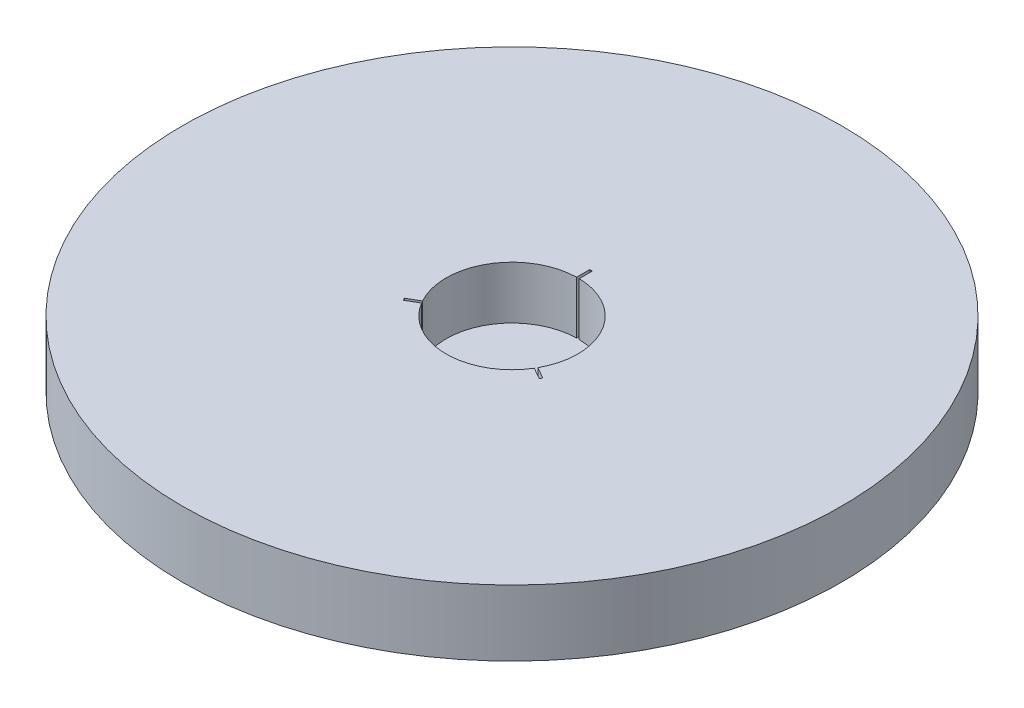
ISO-10303-21;
HEADER;
FILE_DESCRIPTION(('STEP AP214'),'2;1');
FILE_NAME('part.step','',(''),(''),'','','');
FILE_SCHEMA(('AUTOMOTIVE_DESIGN { 1 0 10303 214 1 1 1 1 }'));
ENDSEC;
DATA;
#1=APPLICATION_CONTEXT('core data for automotive mechanical design processes');
#2=APPLICATION_PROTOCOL_DEFINITION('international standard','automotive_design',2000,#1);
#3=PRODUCT_CONTEXT('',#1,'mechanical');
#4=PRODUCT('Part','Part','',(#3));
#5=PRODUCT_RELATED_PRODUCT_CATEGORY('part','',(#4));
#6=PRODUCT_DEFINITION_FORMATION('','',#4);
#7=PRODUCT_DEFINITION_CONTEXT('part definition',#1,'design');
#8=PRODUCT_DEFINITION('design','',#6,#7);
#9=PRODUCT_DEFINITION_SHAPE('','',#8);
#10=(LENGTH_UNIT() NAMED_UNIT(*) SI_UNIT(.MILLI.,.METRE.));
#11=(NAMED_UNIT(*) PLANE_ANGLE_UNIT() SI_UNIT($,.RADIAN.));
#12=(NAMED_UNIT(*) SI_UNIT($,.STERADIAN.) SOLID_ANGLE_UNIT());
#13=UNCERTAINTY_MEASURE_WITH_UNIT(LENGTH_MEASURE(1.E-05),#10,'distance_accuracy_value','');
#14=(GEOMETRIC_REPRESENTATION_CONTEXT(3) GLOBAL_UNCERTAINTY_ASSIGNED_CONTEXT((#13)) GLOBAL_UNIT_ASSIGNED_CONTEXT((#10,
#11,#12)) REPRESENTATION_CONTEXT('',''));
#15=CARTESIAN_POINT('',(0.,0.,0.));
#16=DIRECTION('',(0.,0.,1.));
#17=DIRECTION('',(1.,0.,0.));
#18=AXIS2_PLACEMENT_3D('',#15,#16,#17);
#19=CARTESIAN_POINT('',(0.,25.,0.));
#20=DIRECTION('',(0.,-1.,0.));
#21=DIRECTION('',(0.,0.,-1.));
#22=AXIS2_PLACEMENT_3D('',#19,#20,#21);
#23=CYLINDRICAL_SURFACE('',#22,25.);
#24=DIRECTION('',(0.,-1.,0.));
#25=VECTOR('',#24,1.);
#26=CARTESIAN_POINT('',(0.500000000000007,25.,-24.9949994999));
#27=LINE('',#26,#25);
#28=CARTESIAN_POINT('',(0.500000000000007,25.,-24.9949994999));
#29=VERTEX_POINT('',#28);
#30=CARTESIAN_POINT('',(0.500000000000007,5.,-24.9949994999));
#31=VERTEX_POINT('',#30);
#32=EDGE_CURVE('E132',#29,#31,#27,.T.);
#33=ORIENTED_EDGE('',*,*,#32,.T.);
#34=CARTESIAN_POINT('',(0.,5.,0.));
#35=DIRECTION('',(0.,-1.,0.));
#36=DIRECTION('',(0.,0.,-1.));
#37=AXIS2_PLACEMENT_3D('',#34,#35,#36);
#38=CIRCLE('',#37,25.);
#39=CARTESIAN_POINT('',(21.8963045344932,5.,12.0644870480569));
#40=VERTEX_POINT('',#39);
#41=EDGE_CURVE('E123',#31,#40,#38,.T.);
#42=ORIENTED_EDGE('',*,*,#41,.T.);
#43=DIRECTION('',(0.,-1.,0.));
#44=VECTOR('',#43,1.);
#45=CARTESIAN_POINT('',(21.8963045344932,25.,12.0644870480569));
#46=LINE('',#45,#44);
#47=CARTESIAN_POINT('',(21.8963045344932,25.,12.0644870480569));
#48=VERTEX_POINT('',#47);
#49=EDGE_CURVE('E129',#48,#40,#46,.T.);
#50=ORIENTED_EDGE('',*,*,#49,.F.);
#51=CARTESIAN_POINT('',(0.,25.,0.));
#52=DIRECTION('',(0.,1.,0.));
#53=DIRECTION('',(0.,0.,1.));
#54=AXIS2_PLACEMENT_3D('',#51,#52,#53);
#55=CIRCLE('',#54,25.);
#56=EDGE_CURVE('E133',#48,#29,#55,.T.);
#57=ORIENTED_EDGE('',*,*,#56,.T.);
#58=EDGE_LOOP('',(#33,#42,#50,#57));
#59=FACE_BOUND('',#58,.T.);
#60=ADVANCED_FACE('F36',(#59),#23,.F.);
#61=CARTESIAN_POINT('',(0.500000000000007,25.,-29.9949994999));
#62=DIRECTION('',(-1.,0.,0.));
#63=DIRECTION('',(0.,0.,1.));
#64=AXIS2_PLACEMENT_3D('',#61,#62,#63);
#65=PLANE('',#64);
#66=DIRECTION('',(0.,-1.,0.));
#67=VECTOR('',#66,1.);
#68=CARTESIAN_POINT('',(0.500000000000007,25.,-29.9949994999));
#69=LINE('',#68,#67);
#70=CARTESIAN_POINT('',(0.500000000000007,25.,-29.9949994999));
#71=VERTEX_POINT('',#70);
#72=CARTESIAN_POINT('',(0.500000000000008,5.,-29.9949994999));
#73=VERTEX_POINT('',#72);
#74=EDGE_CURVE('E169',#71,#73,#69,.T.);
#75=ORIENTED_EDGE('',*,*,#74,.T.);
#76=DIRECTION('',(0.,0.,1.));
#77=VECTOR('',#76,1.);
#78=CARTESIAN_POINT('',(0.500000000000007,5.,-29.9949994999));
#79=LINE('',#78,#77);
#80=EDGE_CURVE('E134',#73,#31,#79,.T.);
#81=ORIENTED_EDGE('',*,*,#80,.T.);
#82=ORIENTED_EDGE('',*,*,#32,.F.);
#83=DIRECTION('',(0.,0.,-1.));
#84=VECTOR('',#83,1.);
#85=CARTESIAN_POINT('',(0.500000000000007,25.,-29.9949994999));
#86=LINE('',#85,#84);
#87=EDGE_CURVE('E339',#29,#71,#86,.T.);
#88=ORIENTED_EDGE('',*,*,#87,.T.);
#89=EDGE_LOOP('',(#75,#81,#82,#88));
#90=FACE_BOUND('',#89,.T.);
#91=ADVANCED_FACE('F190',(#90),#65,.T.);
#92=CARTESIAN_POINT('',(-0.499999999999994,25.,-29.9949994999));
#93=DIRECTION('',(0.,0.,1.));
#94=DIRECTION('',(1.,0.,0.));
#95=AXIS2_PLACEMENT_3D('',#92,#93,#94);
#96=PLANE('',#95);
#97=DIRECTION('',(0.,-1.,0.));
#98=VECTOR('',#97,1.);
#99=CARTESIAN_POINT('',(-0.499999999999994,25.,-29.9949994999));
#100=LINE('',#99,#98);
#101=CARTESIAN_POINT('',(-0.499999999999994,25.,-29.9949994999));
#102=VERTEX_POINT('',#101);
#103=CARTESIAN_POINT('',(-0.499999999999994,5.,-29.9949994999));
#104=VERTEX_POINT('',#103);
#105=EDGE_CURVE('E166',#102,#104,#100,.T.);
#106=ORIENTED_EDGE('',*,*,#105,.T.);
#107=DIRECTION('',(1.,0.,0.));
#108=VECTOR('',#107,1.);
#109=CARTESIAN_POINT('',(-0.499999999999994,5.,-29.9949994999));
#110=LINE('',#109,#108);
#111=EDGE_CURVE('E386',#104,#73,#110,.T.);
#112=ORIENTED_EDGE('',*,*,#111,.T.);
#113=ORIENTED_EDGE('',*,*,#74,.F.);
#114=DIRECTION('',(-1.,0.,0.));
#115=VECTOR('',#114,1.);
#116=CARTESIAN_POINT('',(-0.499999999999994,25.,-29.9949994999));
#117=LINE('',#116,#115);
#118=EDGE_CURVE('E341',#71,#102,#117,.T.);
#119=ORIENTED_EDGE('',*,*,#118,.T.);
#120=EDGE_LOOP('',(#106,#112,#113,#119));
#121=FACE_BOUND('',#120,.T.);
#122=ADVANCED_FACE('F195',(#121),#96,.T.);
#123=CARTESIAN_POINT('',(-0.499999999999994,25.,-29.9949994999));
#124=DIRECTION('',(1.,0.,0.));
#125=DIRECTION('',(0.,0.,-1.));
#126=AXIS2_PLACEMENT_3D('',#123,#124,#125);
#127=PLANE('',#126);
#128=DIRECTION('',(0.,-1.,0.));
#129=VECTOR('',#128,1.);
#130=CARTESIAN_POINT('',(-0.499999999999994,25.,-24.9949994999));
#131=LINE('',#130,#129);
#132=CARTESIAN_POINT('',(-0.499999999999994,25.,-24.9949994999));
#133=VERTEX_POINT('',#132);
#134=CARTESIAN_POINT('',(-0.499999999999993,5.,-24.9949994999));
#135=VERTEX_POINT('',#134);
#136=EDGE_CURVE('E163',#133,#135,#131,.T.);
#137=ORIENTED_EDGE('',*,*,#136,.T.);
#138=DIRECTION('',(0.,0.,-1.));
#139=VECTOR('',#138,1.);
#140=CARTESIAN_POINT('',(-0.499999999999994,5.,-29.9949994999));
#141=LINE('',#140,#139);
#142=EDGE_CURVE('E383',#135,#104,#141,.T.);
#143=ORIENTED_EDGE('',*,*,#142,.T.);
#144=ORIENTED_EDGE('',*,*,#105,.F.);
#145=DIRECTION('',(0.,0.,1.));
#146=VECTOR('',#145,1.);
#147=CARTESIAN_POINT('',(-0.499999999999994,25.,-29.9949994999));
#148=LINE('',#147,#146);
#149=EDGE_CURVE('E346',#102,#133,#148,.T.);
#150=ORIENTED_EDGE('',*,*,#149,.T.);
#151=EDGE_LOOP('',(#137,#143,#144,#150));
#152=FACE_BOUND('',#151,.T.);
#153=ADVANCED_FACE('F201',(#152),#127,.T.);
#154=CARTESIAN_POINT('',(0.,25.,0.));
#155=DIRECTION('',(0.,-1.,0.));
#156=DIRECTION('',(0.,0.,-1.));
#157=AXIS2_PLACEMENT_3D('',#154,#155,#156);
#158=CYLINDRICAL_SURFACE('',#157,25.);
#159=DIRECTION('',(0.,-1.,0.));
#160=VECTOR('',#159,1.);
#161=CARTESIAN_POINT('',(-21.8963045344923,25.,12.0644870480585));
#162=LINE('',#161,#160);
#163=CARTESIAN_POINT('',(-21.8963045344923,25.,12.0644870480585));
#164=VERTEX_POINT('',#163);
#165=CARTESIAN_POINT('',(-21.8963045344923,5.,12.0644870480585));
#166=VERTEX_POINT('',#165);
#167=EDGE_CURVE('E160',#164,#166,#162,.T.);
#168=ORIENTED_EDGE('',*,*,#167,.T.);
#169=CARTESIAN_POINT('',(0.,5.,0.));
#170=DIRECTION('',(0.,-1.,0.));
#171=DIRECTION('',(0.,0.,-1.));
#172=AXIS2_PLACEMENT_3D('',#169,#170,#171);
#173=CIRCLE('',#172,25.);
#174=EDGE_CURVE('E380',#166,#135,#173,.T.);
#175=ORIENTED_EDGE('',*,*,#174,.T.);
#176=ORIENTED_EDGE('',*,*,#136,.F.);
#177=CARTESIAN_POINT('',(0.,25.,0.));
#178=DIRECTION('',(0.,1.,0.));
#179=DIRECTION('',(0.,0.,1.));
#180=AXIS2_PLACEMENT_3D('',#177,#178,#179);
#181=CIRCLE('',#180,25.);
#182=EDGE_CURVE('E348',#133,#164,#181,.T.);
#183=ORIENTED_EDGE('',*,*,#182,.T.);
#184=EDGE_LOOP('',(#168,#175,#176,#183));
#185=FACE_BOUND('',#184,.T.);
#186=ADVANCED_FACE('F205',(#185),#158,.F.);
#187=CARTESIAN_POINT('',(-26.2264315534145,25.,14.5644870480585));
#188=DIRECTION('',(0.5,0.,0.866025403784439));
#189=DIRECTION('',(0.866025403784439,0.,-0.5));
#190=AXIS2_PLACEMENT_3D('',#187,#188,#189);
#191=PLANE('',#190);
#192=DIRECTION('',(0.,-1.,0.));
#193=VECTOR('',#192,1.);
#194=CARTESIAN_POINT('',(-26.2264315534145,25.,14.5644870480585));
#195=LINE('',#194,#193);
#196=CARTESIAN_POINT('',(-26.2264315534145,25.,14.5644870480585));
#197=VERTEX_POINT('',#196);
#198=CARTESIAN_POINT('',(-26.2264315534145,5.,14.5644870480585));
#199=VERTEX_POINT('',#198);
#200=EDGE_CURVE('E157',#197,#199,#195,.T.);
#201=ORIENTED_EDGE('',*,*,#200,.T.);
#202=DIRECTION('',(0.866025403784439,0.,-0.5));
#203=VECTOR('',#202,1.);
#204=CARTESIAN_POINT('',(-26.2264315534145,5.,14.5644870480585));
#205=LINE('',#204,#203);
#206=EDGE_CURVE('E377',#199,#166,#205,.T.);
#207=ORIENTED_EDGE('',*,*,#206,.T.);
#208=ORIENTED_EDGE('',*,*,#167,.F.);
#209=DIRECTION('',(-0.866025403784439,0.,0.5));
#210=VECTOR('',#209,1.);
#211=CARTESIAN_POINT('',(-26.2264315534145,25.,14.5644870480585));
#212=LINE('',#211,#210);
#213=EDGE_CURVE('E350',#164,#197,#212,.T.);
#214=ORIENTED_EDGE('',*,*,#213,.T.);
#215=EDGE_LOOP('',(#201,#207,#208,#214));
#216=FACE_BOUND('',#215,.T.);
#217=ADVANCED_FACE('F209',(#216),#191,.T.);
#218=CARTESIAN_POINT('',(-25.7264315534145,25.,15.4305124518429));
#219=DIRECTION('',(0.86602540378444,0.,-0.499999999999998));
#220=DIRECTION('',(-0.499999999999998,0.,-0.86602540378444));
#221=AXIS2_PLACEMENT_3D('',#218,#219,#220);
#222=PLANE('',#221);
#223=DIRECTION('',(0.,-1.,0.));
#224=VECTOR('',#223,1.);
#225=CARTESIAN_POINT('',(-25.7264315534145,25.,15.4305124518429));
#226=LINE('',#225,#224);
#227=CARTESIAN_POINT('',(-25.7264315534145,25.,15.4305124518429));
#228=VERTEX_POINT('',#227);
#229=CARTESIAN_POINT('',(-25.7264315534145,5.,15.4305124518429));
#230=VERTEX_POINT('',#229);
#231=EDGE_CURVE('E154',#228,#230,#226,.T.);
#232=ORIENTED_EDGE('',*,*,#231,.T.);
#233=DIRECTION('',(-0.499999999999998,0.,-0.86602540378444));
#234=VECTOR('',#233,1.);
#235=CARTESIAN_POINT('',(-25.7264315534145,5.,15.4305124518429));
#236=LINE('',#235,#234);
#237=EDGE_CURVE('E371',#230,#199,#236,.T.);
#238=ORIENTED_EDGE('',*,*,#237,.T.);
#239=ORIENTED_EDGE('',*,*,#200,.F.);
#240=DIRECTION('',(0.499999999999998,0.,0.86602540378444));
#241=VECTOR('',#240,1.);
#242=CARTESIAN_POINT('',(-25.7264315534145,25.,15.4305124518429));
#243=LINE('',#242,#241);
#244=EDGE_CURVE('E352',#197,#228,#243,.T.);
#245=ORIENTED_EDGE('',*,*,#244,.T.);
#246=EDGE_LOOP('',(#232,#238,#239,#245));
#247=FACE_BOUND('',#246,.T.);
#248=ADVANCED_FACE('F213',(#247),#222,.T.);
#249=CARTESIAN_POINT('',(-25.7264315534145,25.,15.4305124518429));
#250=DIRECTION('',(-0.5,0.,-0.866025403784439));
#251=DIRECTION('',(-0.866025403784439,0.,0.5));
#252=AXIS2_PLACEMENT_3D('',#249,#250,#251);
#253=PLANE('',#252);
#254=DIRECTION('',(0.,-1.,0.));
#255=VECTOR('',#254,1.);
#256=CARTESIAN_POINT('',(-21.3963045344923,25.,12.9305124518429));
#257=LINE('',#256,#255);
#258=CARTESIAN_POINT('',(-21.3963045344923,25.,12.9305124518429));
#259=VERTEX_POINT('',#258);
#260=CARTESIAN_POINT('',(-21.3963045344923,5.,12.9305124518429));
#261=VERTEX_POINT('',#260);
#262=EDGE_CURVE('E151',#259,#261,#257,.T.);
#263=ORIENTED_EDGE('',*,*,#262,.T.);
#264=DIRECTION('',(-0.866025403784439,0.,0.5));
#265=VECTOR('',#264,1.);
#266=CARTESIAN_POINT('',(-25.7264315534145,5.,15.4305124518429));
#267=LINE('',#266,#265);
#268=EDGE_CURVE('E368',#261,#230,#267,.T.);
#269=ORIENTED_EDGE('',*,*,#268,.T.);
#270=ORIENTED_EDGE('',*,*,#231,.F.);
#271=DIRECTION('',(0.866025403784439,0.,-0.5));
#272=VECTOR('',#271,1.);
#273=CARTESIAN_POINT('',(-25.7264315534145,25.,15.4305124518429));
#274=LINE('',#273,#272);
#275=EDGE_CURVE('E354',#228,#259,#274,.T.);
#276=ORIENTED_EDGE('',*,*,#275,.T.);
#277=EDGE_LOOP('',(#263,#269,#270,#276));
#278=FACE_BOUND('',#277,.T.);
#279=ADVANCED_FACE('F217',(#278),#253,.T.);
#280=CARTESIAN_POINT('',(0.,25.,0.));
#281=DIRECTION('',(0.,-1.,0.));
#282=DIRECTION('',(0.,0.,-1.));
#283=AXIS2_PLACEMENT_3D('',#280,#281,#282);
#284=CYLINDRICAL_SURFACE('',#283,25.);
#285=DIRECTION('',(0.,-1.,0.));
#286=VECTOR('',#285,1.);
#287=CARTESIAN_POINT('',(21.3963045344933,25.,12.9305124518413));
#288=LINE('',#287,#286);
#289=CARTESIAN_POINT('',(21.3963045344933,25.,12.9305124518413));
#290=VERTEX_POINT('',#289);
#291=CARTESIAN_POINT('',(21.3963045344932,5.,12.9305124518413));
#292=VERTEX_POINT('',#291);
#293=EDGE_CURVE('E148',#290,#292,#288,.T.);
#294=ORIENTED_EDGE('',*,*,#293,.T.);
#295=CARTESIAN_POINT('',(0.,5.,0.));
#296=DIRECTION('',(0.,-1.,0.));
#297=DIRECTION('',(0.,0.,-1.));
#298=AXIS2_PLACEMENT_3D('',#295,#296,#297);
#299=CIRCLE('',#298,25.);
#300=EDGE_CURVE('E365',#292,#261,#299,.T.);
#301=ORIENTED_EDGE('',*,*,#300,.T.);
#302=ORIENTED_EDGE('',*,*,#262,.F.);
#303=CARTESIAN_POINT('',(0.,25.,0.));
#304=DIRECTION('',(0.,1.,0.));
#305=DIRECTION('',(0.,0.,1.));
#306=AXIS2_PLACEMENT_3D('',#303,#304,#305);
#307=CIRCLE('',#306,25.);
#308=EDGE_CURVE('E356',#259,#290,#307,.T.);
#309=ORIENTED_EDGE('',*,*,#308,.T.);
#310=EDGE_LOOP('',(#294,#301,#302,#309));
#311=FACE_BOUND('',#310,.T.);
#312=ADVANCED_FACE('F221',(#311),#284,.F.);
#313=CARTESIAN_POINT('',(25.726431553415,25.,15.4305124518411));
#314=DIRECTION('',(0.5,0.,-0.866025403784439));
#315=DIRECTION('',(-0.866025403784439,0.,-0.5));
#316=AXIS2_PLACEMENT_3D('',#313,#314,#315);
#317=PLANE('',#316);
#318=DIRECTION('',(0.,-1.,0.));
#319=VECTOR('',#318,1.);
#320=CARTESIAN_POINT('',(25.726431553415,25.,15.4305124518411));
#321=LINE('',#320,#319);
#322=CARTESIAN_POINT('',(25.726431553415,25.,15.4305124518411));
#323=VERTEX_POINT('',#322);
#324=CARTESIAN_POINT('',(25.726431553415,5.,15.4305124518411));
#325=VERTEX_POINT('',#324);
#326=EDGE_CURVE('E140',#323,#325,#321,.T.);
#327=ORIENTED_EDGE('',*,*,#326,.T.);
#328=DIRECTION('',(-0.866025403784439,0.,-0.5));
#329=VECTOR('',#328,1.);
#330=CARTESIAN_POINT('',(25.726431553415,5.,15.4305124518411));
#331=LINE('',#330,#329);
#332=EDGE_CURVE('E395',#325,#292,#331,.T.);
#333=ORIENTED_EDGE('',*,*,#332,.T.);
#334=ORIENTED_EDGE('',*,*,#293,.F.);
#335=DIRECTION('',(0.866025403784439,0.,0.5));
#336=VECTOR('',#335,1.);
#337=CARTESIAN_POINT('',(25.726431553415,25.,15.4305124518411));
#338=LINE('',#337,#336);
#339=EDGE_CURVE('E336',#290,#323,#338,.T.);
#340=ORIENTED_EDGE('',*,*,#339,.T.);
#341=EDGE_LOOP('',(#327,#333,#334,#340));
#342=FACE_BOUND('',#341,.T.);
#343=ADVANCED_FACE('F225',(#342),#317,.T.);
#344=CARTESIAN_POINT('',(26.2264315534149,25.,14.5644870480566));
#345=DIRECTION('',(-0.866025403784439,0.,-0.499999999999999));
#346=DIRECTION('',(-0.499999999999999,0.,0.866025403784439));
#347=AXIS2_PLACEMENT_3D('',#344,#345,#346);
#348=PLANE('',#347);
#349=DIRECTION('',(0.,-1.,0.));
#350=VECTOR('',#349,1.);
#351=CARTESIAN_POINT('',(26.2264315534149,25.,14.5644870480566));
#352=LINE('',#351,#350);
#353=CARTESIAN_POINT('',(26.2264315534149,25.,14.5644870480567));
#354=VERTEX_POINT('',#353);
#355=CARTESIAN_POINT('',(26.2264315534149,5.,14.5644870480566));
#356=VERTEX_POINT('',#355);
#357=EDGE_CURVE('E57',#354,#356,#352,.T.);
#358=ORIENTED_EDGE('',*,*,#357,.T.);
#359=DIRECTION('',(-0.499999999999999,0.,0.866025403784439));
#360=VECTOR('',#359,1.);
#361=CARTESIAN_POINT('',(26.2264315534149,5.,14.5644870480566));
#362=LINE('',#361,#360);
#363=EDGE_CURVE('E51',#356,#325,#362,.T.);
#364=ORIENTED_EDGE('',*,*,#363,.T.);
#365=ORIENTED_EDGE('',*,*,#326,.F.);
#366=DIRECTION('',(0.499999999999999,0.,-0.866025403784439));
#367=VECTOR('',#366,1.);
#368=CARTESIAN_POINT('',(26.2264315534149,25.,14.5644870480566));
#369=LINE('',#368,#367);
#370=EDGE_CURVE('E142',#323,#354,#369,.T.);
#371=ORIENTED_EDGE('',*,*,#370,.T.);
#372=EDGE_LOOP('',(#358,#364,#365,#371));
#373=FACE_BOUND('',#372,.T.);
#374=ADVANCED_FACE('F229',(#373),#348,.T.);
#375=CARTESIAN_POINT('',(26.2264315534149,25.,14.5644870480566));
#376=DIRECTION('',(-0.500000000000001,0.,0.866025403784438));
#377=DIRECTION('',(0.866025403784438,0.,0.500000000000001));
#378=AXIS2_PLACEMENT_3D('',#375,#376,#377);
#379=PLANE('',#378);
#380=ORIENTED_EDGE('',*,*,#49,.T.);
#381=DIRECTION('',(0.866025403784438,0.,0.500000000000001));
#382=VECTOR('',#381,1.);
#383=CARTESIAN_POINT('',(26.2264315534149,5.,14.5644870480566));
#384=LINE('',#383,#382);
#385=EDGE_CURVE('E11',#40,#356,#384,.T.);
#386=ORIENTED_EDGE('',*,*,#385,.T.);
#387=ORIENTED_EDGE('',*,*,#357,.F.);
#388=DIRECTION('',(-0.866025403784438,0.,-0.500000000000001));
#389=VECTOR('',#388,1.);
#390=CARTESIAN_POINT('',(26.2264315534149,25.,14.5644870480566));
#391=LINE('',#390,#389);
#392=EDGE_CURVE('E138',#354,#48,#391,.T.);
#393=ORIENTED_EDGE('',*,*,#392,.T.);
#394=EDGE_LOOP('',(#380,#386,#387,#393));
#395=FACE_BOUND('',#394,.T.);
#396=ADVANCED_FACE('F136',(#395),#379,.T.);
#397=CARTESIAN_POINT('',(0.,25.,0.));
#398=DIRECTION('',(0.,1.,0.));
#399=DIRECTION('',(0.,0.,1.));
#400=AXIS2_PLACEMENT_3D('',#397,#398,#399);
#401=PLANE('',#400);
#402=CARTESIAN_POINT('',(0.,25.,0.));
#403=DIRECTION('',(0.,1.,0.));
#404=DIRECTION('',(0.,0.,1.));
#405=AXIS2_PLACEMENT_3D('',#402,#403,#404);
#406=CIRCLE('',#405,125.);
#407=CARTESIAN_POINT('',(0.,25.,125.));
#408=VERTEX_POINT('',#407);
#409=EDGE_CURVE('E44',#408,#408,#406,.T.);
#410=ORIENTED_EDGE('',*,*,#409,.T.);
#411=EDGE_LOOP('',(#410));
#412=FACE_BOUND('',#411,.T.);
#413=ORIENTED_EDGE('',*,*,#87,.F.);
#414=ORIENTED_EDGE('',*,*,#56,.F.);
#415=ORIENTED_EDGE('',*,*,#392,.F.);
#416=ORIENTED_EDGE('',*,*,#370,.F.);
#417=ORIENTED_EDGE('',*,*,#339,.F.);
#418=ORIENTED_EDGE('',*,*,#308,.F.);
#419=ORIENTED_EDGE('',*,*,#275,.F.);
#420=ORIENTED_EDGE('',*,*,#244,.F.);
#421=ORIENTED_EDGE('',*,*,#213,.F.);
#422=ORIENTED_EDGE('',*,*,#182,.F.);
#423=ORIENTED_EDGE('',*,*,#149,.F.);
#424=ORIENTED_EDGE('',*,*,#118,.F.);
#425=EDGE_LOOP('',(#413,#414,#415,#416,#417,#418,#419,#420,#421,#422,#423,#424));
#426=FACE_BOUND('',#425,.T.);
#427=ADVANCED_FACE('F182',(#412,#426),#401,.T.);
#428=CARTESIAN_POINT('',(0.,0.,0.));
#429=DIRECTION('',(0.,1.,0.));
#430=DIRECTION('',(0.,0.,1.));
#431=AXIS2_PLACEMENT_3D('',#428,#429,#430);
#432=PLANE('',#431);
#433=CARTESIAN_POINT('',(0.,0.,0.));
#434=DIRECTION('',(0.,1.,0.));
#435=DIRECTION('',(0.,0.,1.));
#436=AXIS2_PLACEMENT_3D('',#433,#434,#435);
#437=CIRCLE('',#436,125.);
#438=CARTESIAN_POINT('',(0.,0.,125.));
#439=VERTEX_POINT('',#438);
#440=EDGE_CURVE('E173',#439,#439,#437,.T.);
#441=ORIENTED_EDGE('',*,*,#440,.F.);
#442=EDGE_LOOP('',(#441));
#443=FACE_BOUND('',#442,.T.);
#444=ADVANCED_FACE('F180',(#443),#432,.F.);
#445=CARTESIAN_POINT('',(0.,25.,0.));
#446=DIRECTION('',(0.,-1.,0.));
#447=DIRECTION('',(0.,0.,-1.));
#448=AXIS2_PLACEMENT_3D('',#445,#446,#447);
#449=CYLINDRICAL_SURFACE('',#448,125.);
#450=ORIENTED_EDGE('',*,*,#440,.T.);
#451=EDGE_LOOP('',(#450));
#452=FACE_BOUND('',#451,.T.);
#453=ORIENTED_EDGE('',*,*,#409,.F.);
#454=EDGE_LOOP('',(#453));
#455=FACE_BOUND('',#454,.T.);
#456=ADVANCED_FACE('F38',(#452,#455),#449,.T.);
#457=CARTESIAN_POINT('',(0.,5.,0.));
#458=DIRECTION('',(0.,-1.,0.));
#459=DIRECTION('',(0.,0.,-1.));
#460=AXIS2_PLACEMENT_3D('',#457,#458,#459);
#461=PLANE('',#460);
#462=ORIENTED_EDGE('',*,*,#41,.F.);
#463=ORIENTED_EDGE('',*,*,#80,.F.);
#464=ORIENTED_EDGE('',*,*,#111,.F.);
#465=ORIENTED_EDGE('',*,*,#142,.F.);
#466=ORIENTED_EDGE('',*,*,#174,.F.);
#467=ORIENTED_EDGE('',*,*,#206,.F.);
#468=ORIENTED_EDGE('',*,*,#237,.F.);
#469=ORIENTED_EDGE('',*,*,#268,.F.);
#470=ORIENTED_EDGE('',*,*,#300,.F.);
#471=ORIENTED_EDGE('',*,*,#332,.F.);
#472=ORIENTED_EDGE('',*,*,#363,.F.);
#473=ORIENTED_EDGE('',*,*,#385,.F.);
#474=EDGE_LOOP('',(#462,#463,#464,#465,#466,#467,#468,#469,#470,#471,#472,#473));
#475=FACE_BOUND('',#474,.T.);
#476=ADVANCED_FACE('F122',(#475),#461,.F.);
#477=CLOSED_SHELL('',(#60,#91,#122,#153,#186,#217,#248,#279,#312,#343,#374,#396,#427,#444,#456,#476));
#478=MANIFOLD_SOLID_BREP('B2',#477);
#479=ADVANCED_BREP_SHAPE_REPRESENTATION('',(#18,#478),#14);
#480=SHAPE_DEFINITION_REPRESENTATION(#9,#479);
ENDSEC;
END-ISO-10303-21;
